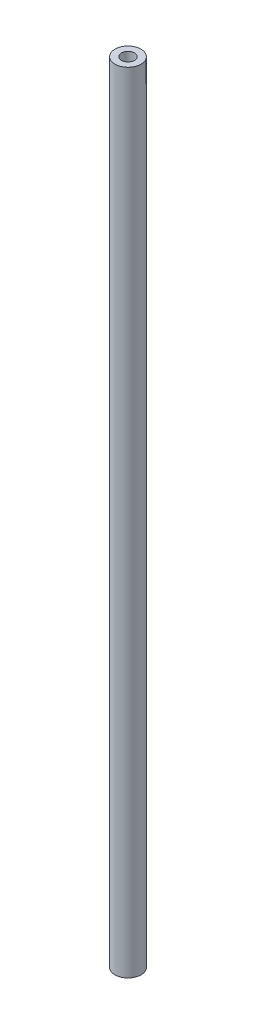
ISO-10303-21;
HEADER;
FILE_DESCRIPTION(('STEP AP214'),'2;1');
FILE_NAME('part.step','',(''),(''),'','','');
FILE_SCHEMA(('AUTOMOTIVE_DESIGN { 1 0 10303 214 1 1 1 1 }'));
ENDSEC;
DATA;
#1=APPLICATION_CONTEXT('core data for automotive mechanical design processes');
#2=APPLICATION_PROTOCOL_DEFINITION('international standard','automotive_design',2000,#1);
#3=PRODUCT_CONTEXT('',#1,'mechanical');
#4=PRODUCT('Part','Part','',(#3));
#5=PRODUCT_RELATED_PRODUCT_CATEGORY('part','',(#4));
#6=PRODUCT_DEFINITION_FORMATION('','',#4);
#7=PRODUCT_DEFINITION_CONTEXT('part definition',#1,'design');
#8=PRODUCT_DEFINITION('design','',#6,#7);
#9=PRODUCT_DEFINITION_SHAPE('','',#8);
#10=(LENGTH_UNIT() NAMED_UNIT(*) SI_UNIT(.MILLI.,.METRE.));
#11=(NAMED_UNIT(*) PLANE_ANGLE_UNIT() SI_UNIT($,.RADIAN.));
#12=(NAMED_UNIT(*) SI_UNIT($,.STERADIAN.) SOLID_ANGLE_UNIT());
#13=UNCERTAINTY_MEASURE_WITH_UNIT(LENGTH_MEASURE(1.E-05),#10,'distance_accuracy_value','');
#14=(GEOMETRIC_REPRESENTATION_CONTEXT(3) GLOBAL_UNCERTAINTY_ASSIGNED_CONTEXT((#13)) GLOBAL_UNIT_ASSIGNED_CONTEXT((#10,
#11,#12)) REPRESENTATION_CONTEXT('',''));
#15=CARTESIAN_POINT('',(0.,0.,0.));
#16=DIRECTION('',(0.,0.,1.));
#17=DIRECTION('',(1.,0.,0.));
#18=AXIS2_PLACEMENT_3D('',#15,#16,#17);
#19=CARTESIAN_POINT('',(0.,384.302,0.));
#20=DIRECTION('',(0.,1.,0.));
#21=DIRECTION('',(0.,0.,1.));
#22=AXIS2_PLACEMENT_3D('',#19,#20,#21);
#23=PLANE('',#22);
#24=CARTESIAN_POINT('',(0.,384.302,0.));
#25=DIRECTION('',(0.,1.,0.));
#26=DIRECTION('',(0.,0.,1.));
#27=AXIS2_PLACEMENT_3D('',#24,#25,#26);
#28=CIRCLE('',#27,6.35);
#29=CARTESIAN_POINT('',(0.,384.302,6.35));
#30=VERTEX_POINT('',#29);
#31=EDGE_CURVE('E10',#30,#30,#28,.T.);
#32=ORIENTED_EDGE('',*,*,#31,.T.);
#33=EDGE_LOOP('',(#32));
#34=FACE_BOUND('',#33,.T.);
#35=CARTESIAN_POINT('',(0.,384.302,0.));
#36=DIRECTION('',(0.,1.,0.));
#37=DIRECTION('',(0.,0.,1.));
#38=AXIS2_PLACEMENT_3D('',#35,#36,#37);
#39=CIRCLE('',#38,3.175);
#40=CARTESIAN_POINT('',(0.,384.302,3.175));
#41=VERTEX_POINT('',#40);
#42=EDGE_CURVE('E42',#41,#41,#39,.T.);
#43=ORIENTED_EDGE('',*,*,#42,.F.);
#44=EDGE_LOOP('',(#43));
#45=FACE_BOUND('',#44,.T.);
#46=ADVANCED_FACE('F31',(#34,#45),#23,.T.);
#47=CARTESIAN_POINT('',(0.,0.,0.));
#48=DIRECTION('',(0.,1.,0.));
#49=DIRECTION('',(0.,0.,1.));
#50=AXIS2_PLACEMENT_3D('',#47,#48,#49);
#51=PLANE('',#50);
#52=CARTESIAN_POINT('',(0.,0.,0.));
#53=DIRECTION('',(0.,1.,0.));
#54=DIRECTION('',(0.,0.,1.));
#55=AXIS2_PLACEMENT_3D('',#52,#53,#54);
#56=CIRCLE('',#55,6.35);
#57=CARTESIAN_POINT('',(0.,0.,6.35));
#58=VERTEX_POINT('',#57);
#59=EDGE_CURVE('E35',#58,#58,#56,.T.);
#60=ORIENTED_EDGE('',*,*,#59,.F.);
#61=EDGE_LOOP('',(#60));
#62=FACE_BOUND('',#61,.T.);
#63=CARTESIAN_POINT('',(0.,0.,0.));
#64=DIRECTION('',(0.,1.,0.));
#65=DIRECTION('',(0.,0.,1.));
#66=AXIS2_PLACEMENT_3D('',#63,#64,#65);
#67=CIRCLE('',#66,3.175);
#68=CARTESIAN_POINT('',(0.,0.,3.175));
#69=VERTEX_POINT('',#68);
#70=EDGE_CURVE('E44',#69,#69,#67,.T.);
#71=ORIENTED_EDGE('',*,*,#70,.T.);
#72=EDGE_LOOP('',(#71));
#73=FACE_BOUND('',#72,.T.);
#74=ADVANCED_FACE('F54',(#62,#73),#51,.F.);
#75=CARTESIAN_POINT('',(0.,384.302,0.));
#76=DIRECTION('',(0.,-1.,0.));
#77=DIRECTION('',(0.,0.,-1.));
#78=AXIS2_PLACEMENT_3D('',#75,#76,#77);
#79=CYLINDRICAL_SURFACE('',#78,6.35);
#80=ORIENTED_EDGE('',*,*,#31,.F.);
#81=EDGE_LOOP('',(#80));
#82=FACE_BOUND('',#81,.T.);
#83=ORIENTED_EDGE('',*,*,#59,.T.);
#84=EDGE_LOOP('',(#83));
#85=FACE_BOUND('',#84,.T.);
#86=ADVANCED_FACE('F33',(#82,#85),#79,.T.);
#87=CARTESIAN_POINT('',(0.,384.302,0.));
#88=DIRECTION('',(0.,-1.,0.));
#89=DIRECTION('',(0.,0.,-1.));
#90=AXIS2_PLACEMENT_3D('',#87,#88,#89);
#91=CYLINDRICAL_SURFACE('',#90,3.175);
#92=ORIENTED_EDGE('',*,*,#42,.T.);
#93=EDGE_LOOP('',(#92));
#94=FACE_BOUND('',#93,.T.);
#95=ORIENTED_EDGE('',*,*,#70,.F.);
#96=EDGE_LOOP('',(#95));
#97=FACE_BOUND('',#96,.T.);
#98=ADVANCED_FACE('F50',(#94,#97),#91,.F.);
#99=CLOSED_SHELL('',(#46,#74,#86,#98));
#100=MANIFOLD_SOLID_BREP('B2',#99);
#101=ADVANCED_BREP_SHAPE_REPRESENTATION('',(#18,#100),#14);
#102=SHAPE_DEFINITION_REPRESENTATION(#9,#101);
ENDSEC;
END-ISO-10303-21;
